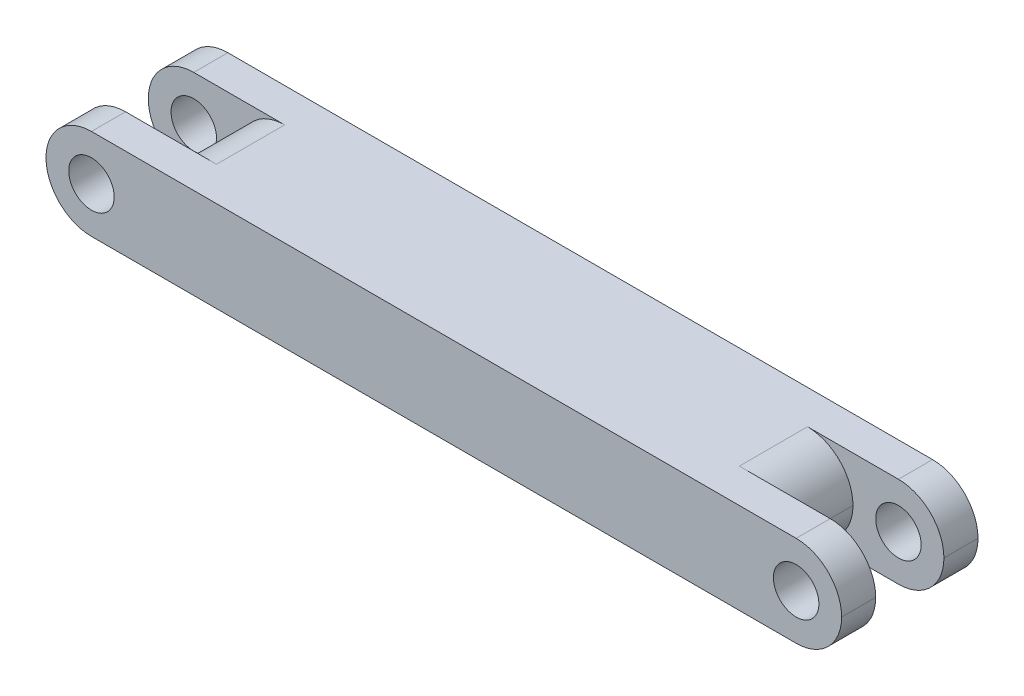
ISO-10303-21;
HEADER;
FILE_DESCRIPTION(('STEP AP214'),'2;1');
FILE_NAME('part.step','',(''),(''),'','','');
FILE_SCHEMA(('AUTOMOTIVE_DESIGN { 1 0 10303 214 1 1 1 1 }'));
ENDSEC;
DATA;
#1=APPLICATION_CONTEXT('core data for automotive mechanical design processes');
#2=APPLICATION_PROTOCOL_DEFINITION('international standard','automotive_design',2000,#1);
#3=PRODUCT_CONTEXT('',#1,'mechanical');
#4=PRODUCT('Part','Part','',(#3));
#5=PRODUCT_RELATED_PRODUCT_CATEGORY('part','',(#4));
#6=PRODUCT_DEFINITION_FORMATION('','',#4);
#7=PRODUCT_DEFINITION_CONTEXT('part definition',#1,'design');
#8=PRODUCT_DEFINITION('design','',#6,#7);
#9=PRODUCT_DEFINITION_SHAPE('','',#8);
#10=(LENGTH_UNIT() NAMED_UNIT(*) SI_UNIT(.MILLI.,.METRE.));
#11=(NAMED_UNIT(*) PLANE_ANGLE_UNIT() SI_UNIT($,.RADIAN.));
#12=(NAMED_UNIT(*) SI_UNIT($,.STERADIAN.) SOLID_ANGLE_UNIT());
#13=UNCERTAINTY_MEASURE_WITH_UNIT(LENGTH_MEASURE(1.E-05),#10,'distance_accuracy_value','');
#14=(GEOMETRIC_REPRESENTATION_CONTEXT(3) GLOBAL_UNCERTAINTY_ASSIGNED_CONTEXT((#13)) GLOBAL_UNIT_ASSIGNED_CONTEXT((#10,
#11,#12)) REPRESENTATION_CONTEXT('',''));
#15=CARTESIAN_POINT('',(0.,0.,0.));
#16=DIRECTION('',(0.,0.,1.));
#17=DIRECTION('',(1.,0.,0.));
#18=AXIS2_PLACEMENT_3D('',#15,#16,#17);
#19=CARTESIAN_POINT('',(-135.,-40.,-15.));
#20=DIRECTION('',(0.,0.,1.));
#21=DIRECTION('',(1.,0.,0.));
#22=AXIS2_PLACEMENT_3D('',#19,#20,#21);
#23=PLANE('',#22);
#24=CARTESIAN_POINT('',(-155.,-20.,-15.));
#25=DIRECTION('',(0.,0.,1.));
#26=DIRECTION('',(1.,0.,0.));
#27=AXIS2_PLACEMENT_3D('',#24,#25,#26);
#28=CIRCLE('',#27,10.);
#29=CARTESIAN_POINT('',(-145.,-20.,-15.));
#30=VERTEX_POINT('',#29);
#31=EDGE_CURVE('E304',#30,#30,#28,.T.);
#32=ORIENTED_EDGE('',*,*,#31,.F.);
#33=EDGE_LOOP('',(#32));
#34=FACE_BOUND('',#33,.T.);
#35=CARTESIAN_POINT('',(-155.,-20.,-15.));
#36=DIRECTION('',(0.,0.,1.));
#37=DIRECTION('',(1.,0.,0.));
#38=AXIS2_PLACEMENT_3D('',#35,#36,#37);
#39=CIRCLE('',#38,20.);
#40=CARTESIAN_POINT('',(-155.,0.,-15.));
#41=VERTEX_POINT('',#40);
#42=CARTESIAN_POINT('',(-175.,-20.,-15.));
#43=VERTEX_POINT('',#42);
#44=EDGE_CURVE('E162',#41,#43,#39,.T.);
#45=ORIENTED_EDGE('',*,*,#44,.T.);
#46=CARTESIAN_POINT('',(-155.,-20.,-15.));
#47=DIRECTION('',(0.,0.,1.));
#48=DIRECTION('',(1.,0.,0.));
#49=AXIS2_PLACEMENT_3D('',#46,#47,#48);
#50=CIRCLE('',#49,20.);
#51=CARTESIAN_POINT('',(-155.,-40.,-15.));
#52=VERTEX_POINT('',#51);
#53=EDGE_CURVE('E157',#43,#52,#50,.T.);
#54=ORIENTED_EDGE('',*,*,#53,.T.);
#55=DIRECTION('',(1.,0.,0.));
#56=VECTOR('',#55,1.);
#57=CARTESIAN_POINT('',(-135.,-40.,-15.));
#58=LINE('',#57,#56);
#59=CARTESIAN_POINT('',(-115.,-40.,-15.));
#60=VERTEX_POINT('',#59);
#61=EDGE_CURVE('E159',#52,#60,#58,.T.);
#62=ORIENTED_EDGE('',*,*,#61,.T.);
#63=CARTESIAN_POINT('',(-115.,-20.,-15.));
#64=DIRECTION('',(0.,0.,1.));
#65=DIRECTION('',(1.,0.,0.));
#66=AXIS2_PLACEMENT_3D('',#63,#64,#65);
#67=CIRCLE('',#66,20.);
#68=CARTESIAN_POINT('',(-135.,-20.,-15.));
#69=VERTEX_POINT('',#68);
#70=EDGE_CURVE('E48',#60,#69,#67,.F.);
#71=ORIENTED_EDGE('',*,*,#70,.T.);
#72=CARTESIAN_POINT('',(-115.,-20.,-15.));
#73=DIRECTION('',(0.,0.,1.));
#74=DIRECTION('',(1.,0.,0.));
#75=AXIS2_PLACEMENT_3D('',#72,#73,#74);
#76=CIRCLE('',#75,20.);
#77=CARTESIAN_POINT('',(-115.,0.,-15.));
#78=VERTEX_POINT('',#77);
#79=EDGE_CURVE('E11',#69,#78,#76,.F.);
#80=ORIENTED_EDGE('',*,*,#79,.T.);
#81=DIRECTION('',(1.,0.,0.));
#82=VECTOR('',#81,1.);
#83=CARTESIAN_POINT('',(-135.,0.,-15.));
#84=LINE('',#83,#82);
#85=EDGE_CURVE('E293',#41,#78,#84,.T.);
#86=ORIENTED_EDGE('',*,*,#85,.F.);
#87=EDGE_LOOP('',(#45,#54,#62,#71,#80,#86));
#88=FACE_BOUND('',#87,.T.);
#89=ADVANCED_FACE('F32',(#34,#88),#23,.T.);
#90=CARTESIAN_POINT('',(-175.,-40.,-30.));
#91=DIRECTION('',(0.,0.,-1.));
#92=DIRECTION('',(-1.,0.,0.));
#93=AXIS2_PLACEMENT_3D('',#90,#91,#92);
#94=PLANE('',#93);
#95=CARTESIAN_POINT('',(155.,-20.,-30.));
#96=DIRECTION('',(0.,0.,-1.));
#97=DIRECTION('',(-1.,0.,0.));
#98=AXIS2_PLACEMENT_3D('',#95,#96,#97);
#99=CIRCLE('',#98,10.);
#100=CARTESIAN_POINT('',(145.,-20.,-30.));
#101=VERTEX_POINT('',#100);
#102=EDGE_CURVE('E438',#101,#101,#99,.F.);
#103=ORIENTED_EDGE('',*,*,#102,.T.);
#104=EDGE_LOOP('',(#103));
#105=FACE_BOUND('',#104,.T.);
#106=CARTESIAN_POINT('',(-155.,-20.,-30.));
#107=DIRECTION('',(0.,0.,-1.));
#108=DIRECTION('',(-1.,0.,0.));
#109=AXIS2_PLACEMENT_3D('',#106,#107,#108);
#110=CIRCLE('',#109,10.);
#111=CARTESIAN_POINT('',(-165.,-20.,-30.));
#112=VERTEX_POINT('',#111);
#113=EDGE_CURVE('E305',#112,#112,#110,.F.);
#114=ORIENTED_EDGE('',*,*,#113,.T.);
#115=EDGE_LOOP('',(#114));
#116=FACE_BOUND('',#115,.T.);
#117=DIRECTION('',(-1.,0.,0.));
#118=VECTOR('',#117,1.);
#119=CARTESIAN_POINT('',(-175.,-40.,-30.));
#120=LINE('',#119,#118);
#121=CARTESIAN_POINT('',(155.,-40.,-30.));
#122=VERTEX_POINT('',#121);
#123=CARTESIAN_POINT('',(-155.,-40.,-30.));
#124=VERTEX_POINT('',#123);
#125=EDGE_CURVE('E307',#122,#124,#120,.T.);
#126=ORIENTED_EDGE('',*,*,#125,.T.);
#127=CARTESIAN_POINT('',(-155.,-20.,-30.));
#128=DIRECTION('',(0.,0.,-1.));
#129=DIRECTION('',(-1.,0.,0.));
#130=AXIS2_PLACEMENT_3D('',#127,#128,#129);
#131=CIRCLE('',#130,20.);
#132=CARTESIAN_POINT('',(-175.,-20.,-30.));
#133=VERTEX_POINT('',#132);
#134=EDGE_CURVE('E182',#124,#133,#131,.T.);
#135=ORIENTED_EDGE('',*,*,#134,.T.);
#136=CARTESIAN_POINT('',(-155.,-20.,-30.));
#137=DIRECTION('',(0.,0.,-1.));
#138=DIRECTION('',(-1.,0.,0.));
#139=AXIS2_PLACEMENT_3D('',#136,#137,#138);
#140=CIRCLE('',#139,20.);
#141=CARTESIAN_POINT('',(-155.,0.,-30.));
#142=VERTEX_POINT('',#141);
#143=EDGE_CURVE('E213',#133,#142,#140,.T.);
#144=ORIENTED_EDGE('',*,*,#143,.T.);
#145=DIRECTION('',(-1.,0.,0.));
#146=VECTOR('',#145,1.);
#147=CARTESIAN_POINT('',(-175.,0.,-30.));
#148=LINE('',#147,#146);
#149=CARTESIAN_POINT('',(155.,0.,-30.));
#150=VERTEX_POINT('',#149);
#151=EDGE_CURVE('E179',#150,#142,#148,.T.);
#152=ORIENTED_EDGE('',*,*,#151,.F.);
#153=CARTESIAN_POINT('',(155.,-20.,-30.));
#154=DIRECTION('',(0.,0.,-1.));
#155=DIRECTION('',(-1.,0.,0.));
#156=AXIS2_PLACEMENT_3D('',#153,#154,#155);
#157=CIRCLE('',#156,20.);
#158=CARTESIAN_POINT('',(175.,-20.,-30.));
#159=VERTEX_POINT('',#158);
#160=EDGE_CURVE('E211',#150,#159,#157,.T.);
#161=ORIENTED_EDGE('',*,*,#160,.T.);
#162=CARTESIAN_POINT('',(155.,-20.,-30.));
#163=DIRECTION('',(0.,0.,-1.));
#164=DIRECTION('',(-1.,0.,0.));
#165=AXIS2_PLACEMENT_3D('',#162,#163,#164);
#166=CIRCLE('',#165,20.);
#167=EDGE_CURVE('E167',#159,#122,#166,.T.);
#168=ORIENTED_EDGE('',*,*,#167,.T.);
#169=EDGE_LOOP('',(#126,#135,#144,#152,#161,#168));
#170=FACE_BOUND('',#169,.T.);
#171=ADVANCED_FACE('F376',(#105,#116,#170),#94,.T.);
#172=CARTESIAN_POINT('',(175.,-40.,-15.));
#173=DIRECTION('',(0.,0.,1.));
#174=DIRECTION('',(1.,0.,0.));
#175=AXIS2_PLACEMENT_3D('',#172,#173,#174);
#176=PLANE('',#175);
#177=CARTESIAN_POINT('',(155.,-20.,-15.));
#178=DIRECTION('',(0.,0.,1.));
#179=DIRECTION('',(1.,0.,0.));
#180=AXIS2_PLACEMENT_3D('',#177,#178,#179);
#181=CIRCLE('',#180,10.);
#182=CARTESIAN_POINT('',(165.,-20.,-15.));
#183=VERTEX_POINT('',#182);
#184=EDGE_CURVE('E431',#183,#183,#181,.T.);
#185=ORIENTED_EDGE('',*,*,#184,.F.);
#186=EDGE_LOOP('',(#185));
#187=FACE_BOUND('',#186,.T.);
#188=CARTESIAN_POINT('',(155.,-20.,-15.));
#189=DIRECTION('',(0.,0.,1.));
#190=DIRECTION('',(1.,0.,0.));
#191=AXIS2_PLACEMENT_3D('',#188,#189,#190);
#192=CIRCLE('',#191,20.);
#193=CARTESIAN_POINT('',(155.,-40.,-15.));
#194=VERTEX_POINT('',#193);
#195=CARTESIAN_POINT('',(175.,-20.,-15.));
#196=VERTEX_POINT('',#195);
#197=EDGE_CURVE('E228',#194,#196,#192,.T.);
#198=ORIENTED_EDGE('',*,*,#197,.T.);
#199=CARTESIAN_POINT('',(155.,-20.,-15.));
#200=DIRECTION('',(0.,0.,1.));
#201=DIRECTION('',(1.,0.,0.));
#202=AXIS2_PLACEMENT_3D('',#199,#200,#201);
#203=CIRCLE('',#202,20.);
#204=CARTESIAN_POINT('',(155.,0.,-15.));
#205=VERTEX_POINT('',#204);
#206=EDGE_CURVE('E230',#196,#205,#203,.T.);
#207=ORIENTED_EDGE('',*,*,#206,.T.);
#208=DIRECTION('',(1.,0.,0.));
#209=VECTOR('',#208,1.);
#210=CARTESIAN_POINT('',(175.,0.,-15.));
#211=LINE('',#210,#209);
#212=CARTESIAN_POINT('',(115.,0.,-15.));
#213=VERTEX_POINT('',#212);
#214=EDGE_CURVE('E291',#213,#205,#211,.T.);
#215=ORIENTED_EDGE('',*,*,#214,.F.);
#216=CARTESIAN_POINT('',(115.,-20.,-15.));
#217=DIRECTION('',(0.,0.,1.));
#218=DIRECTION('',(1.,0.,0.));
#219=AXIS2_PLACEMENT_3D('',#216,#217,#218);
#220=CIRCLE('',#219,20.);
#221=CARTESIAN_POINT('',(135.,-20.,-15.));
#222=VERTEX_POINT('',#221);
#223=EDGE_CURVE('E241',#213,#222,#220,.F.);
#224=ORIENTED_EDGE('',*,*,#223,.T.);
#225=CARTESIAN_POINT('',(115.,-20.,-15.));
#226=DIRECTION('',(0.,0.,1.));
#227=DIRECTION('',(1.,0.,0.));
#228=AXIS2_PLACEMENT_3D('',#225,#226,#227);
#229=CIRCLE('',#228,20.);
#230=CARTESIAN_POINT('',(115.,-40.,-15.));
#231=VERTEX_POINT('',#230);
#232=EDGE_CURVE('E236',#222,#231,#229,.F.);
#233=ORIENTED_EDGE('',*,*,#232,.T.);
#234=DIRECTION('',(1.,0.,0.));
#235=VECTOR('',#234,1.);
#236=CARTESIAN_POINT('',(175.,-40.,-15.));
#237=LINE('',#236,#235);
#238=EDGE_CURVE('E310',#231,#194,#237,.T.);
#239=ORIENTED_EDGE('',*,*,#238,.T.);
#240=EDGE_LOOP('',(#198,#207,#215,#224,#233,#239));
#241=FACE_BOUND('',#240,.T.);
#242=ADVANCED_FACE('F315',(#187,#241),#176,.T.);
#243=CARTESIAN_POINT('',(175.,-40.,15.));
#244=DIRECTION('',(0.,0.,-1.));
#245=DIRECTION('',(-1.,0.,0.));
#246=AXIS2_PLACEMENT_3D('',#243,#244,#245);
#247=PLANE('',#246);
#248=CARTESIAN_POINT('',(155.,-20.,15.));
#249=DIRECTION('',(0.,0.,-1.));
#250=DIRECTION('',(-1.,0.,0.));
#251=AXIS2_PLACEMENT_3D('',#248,#249,#250);
#252=CIRCLE('',#251,10.);
#253=CARTESIAN_POINT('',(145.,-20.,15.));
#254=VERTEX_POINT('',#253);
#255=EDGE_CURVE('E433',#254,#254,#252,.T.);
#256=ORIENTED_EDGE('',*,*,#255,.F.);
#257=EDGE_LOOP('',(#256));
#258=FACE_BOUND('',#257,.T.);
#259=CARTESIAN_POINT('',(155.,-20.,15.));
#260=DIRECTION('',(0.,0.,-1.));
#261=DIRECTION('',(-1.,0.,0.));
#262=AXIS2_PLACEMENT_3D('',#259,#260,#261);
#263=CIRCLE('',#262,20.);
#264=CARTESIAN_POINT('',(155.,0.,15.));
#265=VERTEX_POINT('',#264);
#266=CARTESIAN_POINT('',(175.,-20.,15.));
#267=VERTEX_POINT('',#266);
#268=EDGE_CURVE('E232',#265,#267,#263,.T.);
#269=ORIENTED_EDGE('',*,*,#268,.T.);
#270=CARTESIAN_POINT('',(155.,-20.,15.));
#271=DIRECTION('',(0.,0.,-1.));
#272=DIRECTION('',(-1.,0.,0.));
#273=AXIS2_PLACEMENT_3D('',#270,#271,#272);
#274=CIRCLE('',#273,20.);
#275=CARTESIAN_POINT('',(155.,-40.,15.));
#276=VERTEX_POINT('',#275);
#277=EDGE_CURVE('E234',#267,#276,#274,.T.);
#278=ORIENTED_EDGE('',*,*,#277,.T.);
#279=DIRECTION('',(-1.,0.,0.));
#280=VECTOR('',#279,1.);
#281=CARTESIAN_POINT('',(175.,-40.,15.));
#282=LINE('',#281,#280);
#283=CARTESIAN_POINT('',(115.,-40.,15.));
#284=VERTEX_POINT('',#283);
#285=EDGE_CURVE('E318',#276,#284,#282,.T.);
#286=ORIENTED_EDGE('',*,*,#285,.T.);
#287=CARTESIAN_POINT('',(115.,-20.,15.));
#288=DIRECTION('',(0.,0.,-1.));
#289=DIRECTION('',(-1.,0.,0.));
#290=AXIS2_PLACEMENT_3D('',#287,#288,#289);
#291=CIRCLE('',#290,20.);
#292=CARTESIAN_POINT('',(135.,-20.,15.));
#293=VERTEX_POINT('',#292);
#294=EDGE_CURVE('E239',#284,#293,#291,.F.);
#295=ORIENTED_EDGE('',*,*,#294,.T.);
#296=CARTESIAN_POINT('',(115.,-20.,15.));
#297=DIRECTION('',(0.,0.,-1.));
#298=DIRECTION('',(-1.,0.,0.));
#299=AXIS2_PLACEMENT_3D('',#296,#297,#298);
#300=CIRCLE('',#299,20.);
#301=CARTESIAN_POINT('',(115.,0.,15.));
#302=VERTEX_POINT('',#301);
#303=EDGE_CURVE('E243',#293,#302,#300,.F.);
#304=ORIENTED_EDGE('',*,*,#303,.T.);
#305=DIRECTION('',(-1.,0.,0.));
#306=VECTOR('',#305,1.);
#307=CARTESIAN_POINT('',(175.,0.,15.));
#308=LINE('',#307,#306);
#309=EDGE_CURVE('E288',#265,#302,#308,.T.);
#310=ORIENTED_EDGE('',*,*,#309,.F.);
#311=EDGE_LOOP('',(#269,#278,#286,#295,#304,#310));
#312=FACE_BOUND('',#311,.T.);
#313=ADVANCED_FACE('F414',(#258,#312),#247,.T.);
#314=CARTESIAN_POINT('',(-175.,-40.,30.));
#315=DIRECTION('',(0.,0.,1.));
#316=DIRECTION('',(1.,0.,0.));
#317=AXIS2_PLACEMENT_3D('',#314,#315,#316);
#318=PLANE('',#317);
#319=CARTESIAN_POINT('',(155.,-20.,30.));
#320=DIRECTION('',(0.,0.,1.));
#321=DIRECTION('',(-1.,0.,0.));
#322=AXIS2_PLACEMENT_3D('',#319,#320,#321);
#323=CIRCLE('',#322,10.);
#324=CARTESIAN_POINT('',(145.,-20.,30.));
#325=VERTEX_POINT('',#324);
#326=EDGE_CURVE('E253',#325,#325,#323,.T.);
#327=ORIENTED_EDGE('',*,*,#326,.F.);
#328=EDGE_LOOP('',(#327));
#329=FACE_BOUND('',#328,.T.);
#330=CARTESIAN_POINT('',(-155.,-20.,30.));
#331=DIRECTION('',(0.,0.,1.));
#332=DIRECTION('',(1.,0.,0.));
#333=AXIS2_PLACEMENT_3D('',#330,#331,#332);
#334=CIRCLE('',#333,10.);
#335=CARTESIAN_POINT('',(-145.,-20.,30.));
#336=VERTEX_POINT('',#335);
#337=EDGE_CURVE('E429',#336,#336,#334,.T.);
#338=ORIENTED_EDGE('',*,*,#337,.F.);
#339=EDGE_LOOP('',(#338));
#340=FACE_BOUND('',#339,.T.);
#341=DIRECTION('',(1.,0.,0.));
#342=VECTOR('',#341,1.);
#343=CARTESIAN_POINT('',(-175.,0.,30.));
#344=LINE('',#343,#342);
#345=CARTESIAN_POINT('',(-155.,0.,30.));
#346=VERTEX_POINT('',#345);
#347=CARTESIAN_POINT('',(155.,0.,30.));
#348=VERTEX_POINT('',#347);
#349=EDGE_CURVE('E281',#346,#348,#344,.T.);
#350=ORIENTED_EDGE('',*,*,#349,.F.);
#351=CARTESIAN_POINT('',(-155.,-20.,30.));
#352=DIRECTION('',(0.,0.,1.));
#353=DIRECTION('',(1.,0.,0.));
#354=AXIS2_PLACEMENT_3D('',#351,#352,#353);
#355=CIRCLE('',#354,20.);
#356=CARTESIAN_POINT('',(-175.,-20.,30.));
#357=VERTEX_POINT('',#356);
#358=EDGE_CURVE('E222',#346,#357,#355,.T.);
#359=ORIENTED_EDGE('',*,*,#358,.T.);
#360=CARTESIAN_POINT('',(-155.,-20.,30.));
#361=DIRECTION('',(0.,0.,1.));
#362=DIRECTION('',(1.,0.,0.));
#363=AXIS2_PLACEMENT_3D('',#360,#361,#362);
#364=CIRCLE('',#363,20.);
#365=CARTESIAN_POINT('',(-155.,-40.,30.));
#366=VERTEX_POINT('',#365);
#367=EDGE_CURVE('E220',#357,#366,#364,.T.);
#368=ORIENTED_EDGE('',*,*,#367,.T.);
#369=DIRECTION('',(1.,0.,0.));
#370=VECTOR('',#369,1.);
#371=CARTESIAN_POINT('',(-175.,-40.,30.));
#372=LINE('',#371,#370);
#373=CARTESIAN_POINT('',(155.,-40.,30.));
#374=VERTEX_POINT('',#373);
#375=EDGE_CURVE('E336',#366,#374,#372,.T.);
#376=ORIENTED_EDGE('',*,*,#375,.T.);
#377=CARTESIAN_POINT('',(155.,-20.,30.));
#378=DIRECTION('',(0.,0.,1.));
#379=DIRECTION('',(1.,0.,0.));
#380=AXIS2_PLACEMENT_3D('',#377,#378,#379);
#381=CIRCLE('',#380,20.);
#382=CARTESIAN_POINT('',(175.,-20.,30.));
#383=VERTEX_POINT('',#382);
#384=EDGE_CURVE('E218',#374,#383,#381,.T.);
#385=ORIENTED_EDGE('',*,*,#384,.T.);
#386=CARTESIAN_POINT('',(155.,-20.,30.));
#387=DIRECTION('',(0.,0.,1.));
#388=DIRECTION('',(1.,0.,0.));
#389=AXIS2_PLACEMENT_3D('',#386,#387,#388);
#390=CIRCLE('',#389,20.);
#391=EDGE_CURVE('E216',#383,#348,#390,.T.);
#392=ORIENTED_EDGE('',*,*,#391,.T.);
#393=EDGE_LOOP('',(#350,#359,#368,#376,#385,#392));
#394=FACE_BOUND('',#393,.T.);
#395=ADVANCED_FACE('F280',(#329,#340,#394),#318,.T.);
#396=CARTESIAN_POINT('',(-135.,-40.,15.));
#397=DIRECTION('',(0.,0.,-1.));
#398=DIRECTION('',(-1.,0.,0.));
#399=AXIS2_PLACEMENT_3D('',#396,#397,#398);
#400=PLANE('',#399);
#401=CARTESIAN_POINT('',(-155.,-20.,15.));
#402=DIRECTION('',(0.,0.,-1.));
#403=DIRECTION('',(-1.,0.,0.));
#404=AXIS2_PLACEMENT_3D('',#401,#402,#403);
#405=CIRCLE('',#404,10.);
#406=CARTESIAN_POINT('',(-165.,-20.,15.));
#407=VERTEX_POINT('',#406);
#408=EDGE_CURVE('E301',#407,#407,#405,.T.);
#409=ORIENTED_EDGE('',*,*,#408,.F.);
#410=EDGE_LOOP('',(#409));
#411=FACE_BOUND('',#410,.T.);
#412=CARTESIAN_POINT('',(-155.,-20.,15.));
#413=DIRECTION('',(0.,0.,-1.));
#414=DIRECTION('',(-1.,0.,0.));
#415=AXIS2_PLACEMENT_3D('',#412,#413,#414);
#416=CIRCLE('',#415,20.);
#417=CARTESIAN_POINT('',(-155.,-40.,15.));
#418=VERTEX_POINT('',#417);
#419=CARTESIAN_POINT('',(-175.,-20.,15.));
#420=VERTEX_POINT('',#419);
#421=EDGE_CURVE('E224',#418,#420,#416,.T.);
#422=ORIENTED_EDGE('',*,*,#421,.T.);
#423=CARTESIAN_POINT('',(-155.,-20.,15.));
#424=DIRECTION('',(0.,0.,-1.));
#425=DIRECTION('',(-1.,0.,0.));
#426=AXIS2_PLACEMENT_3D('',#423,#424,#425);
#427=CIRCLE('',#426,20.);
#428=CARTESIAN_POINT('',(-155.,0.,15.));
#429=VERTEX_POINT('',#428);
#430=EDGE_CURVE('E226',#420,#429,#427,.T.);
#431=ORIENTED_EDGE('',*,*,#430,.T.);
#432=DIRECTION('',(-1.,0.,0.));
#433=VECTOR('',#432,1.);
#434=CARTESIAN_POINT('',(-135.,0.,15.));
#435=LINE('',#434,#433);
#436=CARTESIAN_POINT('',(-115.,0.,15.));
#437=VERTEX_POINT('',#436);
#438=EDGE_CURVE('E289',#437,#429,#435,.T.);
#439=ORIENTED_EDGE('',*,*,#438,.F.);
#440=CARTESIAN_POINT('',(-115.,-20.,15.));
#441=DIRECTION('',(0.,0.,-1.));
#442=DIRECTION('',(-1.,0.,0.));
#443=AXIS2_PLACEMENT_3D('',#440,#441,#442);
#444=CIRCLE('',#443,20.);
#445=CARTESIAN_POINT('',(-135.,-20.,15.));
#446=VERTEX_POINT('',#445);
#447=EDGE_CURVE('E41',#437,#446,#444,.F.);
#448=ORIENTED_EDGE('',*,*,#447,.T.);
#449=CARTESIAN_POINT('',(-115.,-20.,15.));
#450=DIRECTION('',(0.,0.,-1.));
#451=DIRECTION('',(-1.,0.,0.));
#452=AXIS2_PLACEMENT_3D('',#449,#450,#451);
#453=CIRCLE('',#452,20.);
#454=CARTESIAN_POINT('',(-115.,-40.,15.));
#455=VERTEX_POINT('',#454);
#456=EDGE_CURVE('E246',#446,#455,#453,.F.);
#457=ORIENTED_EDGE('',*,*,#456,.T.);
#458=DIRECTION('',(-1.,0.,0.));
#459=VECTOR('',#458,1.);
#460=CARTESIAN_POINT('',(-135.,-40.,15.));
#461=LINE('',#460,#459);
#462=EDGE_CURVE('E178',#455,#418,#461,.T.);
#463=ORIENTED_EDGE('',*,*,#462,.T.);
#464=EDGE_LOOP('',(#422,#431,#439,#448,#457,#463));
#465=FACE_BOUND('',#464,.T.);
#466=ADVANCED_FACE('F349',(#411,#465),#400,.T.);
#467=CARTESIAN_POINT('',(0.,-40.,0.));
#468=DIRECTION('',(0.,-1.,0.));
#469=DIRECTION('',(0.,0.,-1.));
#470=AXIS2_PLACEMENT_3D('',#467,#468,#469);
#471=PLANE('',#470);
#472=ORIENTED_EDGE('',*,*,#238,.F.);
#473=DIRECTION('',(0.,0.,-1.));
#474=VECTOR('',#473,1.);
#475=CARTESIAN_POINT('',(115.,-40.,0.));
#476=LINE('',#475,#474);
#477=EDGE_CURVE('E185',#231,#284,#476,.F.);
#478=ORIENTED_EDGE('',*,*,#477,.T.);
#479=ORIENTED_EDGE('',*,*,#285,.F.);
#480=DIRECTION('',(0.,0.,-1.));
#481=VECTOR('',#480,1.);
#482=CARTESIAN_POINT('',(155.,-40.,0.));
#483=LINE('',#482,#481);
#484=EDGE_CURVE('E306',#276,#374,#483,.F.);
#485=ORIENTED_EDGE('',*,*,#484,.T.);
#486=ORIENTED_EDGE('',*,*,#375,.F.);
#487=DIRECTION('',(0.,0.,1.));
#488=VECTOR('',#487,1.);
#489=CARTESIAN_POINT('',(-155.,-40.,0.));
#490=LINE('',#489,#488);
#491=EDGE_CURVE('E183',#366,#418,#490,.F.);
#492=ORIENTED_EDGE('',*,*,#491,.T.);
#493=ORIENTED_EDGE('',*,*,#462,.F.);
#494=DIRECTION('',(0.,0.,1.));
#495=VECTOR('',#494,1.);
#496=CARTESIAN_POINT('',(-115.,-40.,-2.12792746386488E-13));
#497=LINE('',#496,#495);
#498=EDGE_CURVE('E177',#455,#60,#497,.F.);
#499=ORIENTED_EDGE('',*,*,#498,.T.);
#500=ORIENTED_EDGE('',*,*,#61,.F.);
#501=DIRECTION('',(0.,0.,1.));
#502=VECTOR('',#501,1.);
#503=CARTESIAN_POINT('',(-155.,-40.,0.));
#504=LINE('',#503,#502);
#505=EDGE_CURVE('E174',#52,#124,#504,.F.);
#506=ORIENTED_EDGE('',*,*,#505,.T.);
#507=ORIENTED_EDGE('',*,*,#125,.F.);
#508=DIRECTION('',(0.,0.,-1.));
#509=VECTOR('',#508,1.);
#510=CARTESIAN_POINT('',(155.,-40.,0.));
#511=LINE('',#510,#509);
#512=EDGE_CURVE('E187',#122,#194,#511,.F.);
#513=ORIENTED_EDGE('',*,*,#512,.T.);
#514=EDGE_LOOP('',(#472,#478,#479,#485,#486,#492,#493,#499,#500,#506,#507,#513));
#515=FACE_BOUND('',#514,.T.);
#516=ADVANCED_FACE('F172',(#515),#471,.T.);
#517=CARTESIAN_POINT('',(0.,0.,0.));
#518=DIRECTION('',(0.,-1.,0.));
#519=DIRECTION('',(0.,0.,-1.));
#520=AXIS2_PLACEMENT_3D('',#517,#518,#519);
#521=PLANE('',#520);
#522=DIRECTION('',(0.,0.,-1.));
#523=VECTOR('',#522,1.);
#524=CARTESIAN_POINT('',(115.,0.,-15.));
#525=LINE('',#524,#523);
#526=EDGE_CURVE('E206',#302,#213,#525,.T.);
#527=ORIENTED_EDGE('',*,*,#526,.T.);
#528=ORIENTED_EDGE('',*,*,#214,.T.);
#529=DIRECTION('',(0.,0.,-1.));
#530=VECTOR('',#529,1.);
#531=CARTESIAN_POINT('',(155.,0.,-30.));
#532=LINE('',#531,#530);
#533=EDGE_CURVE('E195',#205,#150,#532,.T.);
#534=ORIENTED_EDGE('',*,*,#533,.T.);
#535=ORIENTED_EDGE('',*,*,#151,.T.);
#536=DIRECTION('',(0.,0.,1.));
#537=VECTOR('',#536,1.);
#538=CARTESIAN_POINT('',(-155.,0.,-15.));
#539=LINE('',#538,#537);
#540=EDGE_CURVE('E201',#142,#41,#539,.T.);
#541=ORIENTED_EDGE('',*,*,#540,.T.);
#542=ORIENTED_EDGE('',*,*,#85,.T.);
#543=DIRECTION('',(0.,0.,1.));
#544=VECTOR('',#543,1.);
#545=CARTESIAN_POINT('',(-115.,0.,15.));
#546=LINE('',#545,#544);
#547=EDGE_CURVE('E203',#78,#437,#546,.T.);
#548=ORIENTED_EDGE('',*,*,#547,.T.);
#549=ORIENTED_EDGE('',*,*,#438,.T.);
#550=DIRECTION('',(0.,0.,1.));
#551=VECTOR('',#550,1.);
#552=CARTESIAN_POINT('',(-155.,0.,30.));
#553=LINE('',#552,#551);
#554=EDGE_CURVE('E198',#429,#346,#553,.T.);
#555=ORIENTED_EDGE('',*,*,#554,.T.);
#556=ORIENTED_EDGE('',*,*,#349,.T.);
#557=DIRECTION('',(0.,0.,-1.));
#558=VECTOR('',#557,1.);
#559=CARTESIAN_POINT('',(155.,0.,15.));
#560=LINE('',#559,#558);
#561=EDGE_CURVE('E193',#348,#265,#560,.T.);
#562=ORIENTED_EDGE('',*,*,#561,.T.);
#563=ORIENTED_EDGE('',*,*,#309,.T.);
#564=EDGE_LOOP('',(#527,#528,#534,#535,#541,#542,#548,#549,#555,#556,#562,#563));
#565=FACE_BOUND('',#564,.T.);
#566=ADVANCED_FACE('F284',(#565),#521,.F.);
#567=CARTESIAN_POINT('',(-155.,-20.,-58.2842712474619));
#568=DIRECTION('',(0.,0.,1.));
#569=DIRECTION('',(1.,0.,0.));
#570=AXIS2_PLACEMENT_3D('',#567,#568,#569);
#571=CYLINDRICAL_SURFACE('',#570,10.);
#572=ORIENTED_EDGE('',*,*,#408,.T.);
#573=EDGE_LOOP('',(#572));
#574=FACE_BOUND('',#573,.T.);
#575=ORIENTED_EDGE('',*,*,#337,.T.);
#576=EDGE_LOOP('',(#575));
#577=FACE_BOUND('',#576,.T.);
#578=ADVANCED_FACE('F404',(#574,#577),#571,.F.);
#579=ORIENTED_EDGE('',*,*,#31,.T.);
#580=EDGE_LOOP('',(#579));
#581=FACE_BOUND('',#580,.T.);
#582=ORIENTED_EDGE('',*,*,#113,.F.);
#583=EDGE_LOOP('',(#582));
#584=FACE_BOUND('',#583,.T.);
#585=ADVANCED_FACE('F399',(#581,#584),#571,.F.);
#586=CARTESIAN_POINT('',(155.,-20.,-58.2842712474619));
#587=DIRECTION('',(0.,0.,1.));
#588=DIRECTION('',(1.,0.,0.));
#589=AXIS2_PLACEMENT_3D('',#586,#587,#588);
#590=CYLINDRICAL_SURFACE('',#589,10.);
#591=ORIENTED_EDGE('',*,*,#255,.T.);
#592=EDGE_LOOP('',(#591));
#593=FACE_BOUND('',#592,.T.);
#594=ORIENTED_EDGE('',*,*,#326,.T.);
#595=EDGE_LOOP('',(#594));
#596=FACE_BOUND('',#595,.T.);
#597=ADVANCED_FACE('F393',(#593,#596),#590,.F.);
#598=ORIENTED_EDGE('',*,*,#184,.T.);
#599=EDGE_LOOP('',(#598));
#600=FACE_BOUND('',#599,.T.);
#601=ORIENTED_EDGE('',*,*,#102,.F.);
#602=EDGE_LOOP('',(#601));
#603=FACE_BOUND('',#602,.T.);
#604=ADVANCED_FACE('F389',(#600,#603),#590,.F.);
#605=CARTESIAN_POINT('',(115.,-20.,0.));
#606=DIRECTION('',(0.,0.,1.));
#607=DIRECTION('',(1.,0.,0.));
#608=AXIS2_PLACEMENT_3D('',#605,#606,#607);
#609=CYLINDRICAL_SURFACE('',#608,20.);
#610=ORIENTED_EDGE('',*,*,#526,.F.);
#611=ORIENTED_EDGE('',*,*,#303,.F.);
#612=DIRECTION('',(0.,0.,-1.));
#613=VECTOR('',#612,1.);
#614=CARTESIAN_POINT('',(135.,-20.,15.));
#615=LINE('',#614,#613);
#616=EDGE_CURVE('E250',#222,#293,#615,.F.);
#617=ORIENTED_EDGE('',*,*,#616,.F.);
#618=ORIENTED_EDGE('',*,*,#223,.F.);
#619=EDGE_LOOP('',(#610,#611,#617,#618));
#620=FACE_BOUND('',#619,.T.);
#621=ADVANCED_FACE('F329',(#620),#609,.T.);
#622=CARTESIAN_POINT('',(115.,-20.,-15.));
#623=DIRECTION('',(0.,0.,-1.));
#624=DIRECTION('',(-1.,0.,0.));
#625=AXIS2_PLACEMENT_3D('',#622,#623,#624);
#626=CYLINDRICAL_SURFACE('',#625,20.);
#627=ORIENTED_EDGE('',*,*,#294,.F.);
#628=ORIENTED_EDGE('',*,*,#477,.F.);
#629=ORIENTED_EDGE('',*,*,#232,.F.);
#630=ORIENTED_EDGE('',*,*,#616,.T.);
#631=EDGE_LOOP('',(#627,#628,#629,#630));
#632=FACE_BOUND('',#631,.T.);
#633=ADVANCED_FACE('F332',(#632),#626,.T.);
#634=CARTESIAN_POINT('',(-115.,-20.,-2.12792746386488E-13));
#635=DIRECTION('',(0.,0.,-1.));
#636=DIRECTION('',(-1.,0.,0.));
#637=AXIS2_PLACEMENT_3D('',#634,#635,#636);
#638=CYLINDRICAL_SURFACE('',#637,20.);
#639=ORIENTED_EDGE('',*,*,#547,.F.);
#640=ORIENTED_EDGE('',*,*,#79,.F.);
#641=DIRECTION('',(0.,0.,1.));
#642=VECTOR('',#641,1.);
#643=CARTESIAN_POINT('',(-135.,-20.,-15.));
#644=LINE('',#643,#642);
#645=EDGE_CURVE('E254',#446,#69,#644,.F.);
#646=ORIENTED_EDGE('',*,*,#645,.F.);
#647=ORIENTED_EDGE('',*,*,#447,.F.);
#648=EDGE_LOOP('',(#639,#640,#646,#647));
#649=FACE_BOUND('',#648,.T.);
#650=ADVANCED_FACE('F361',(#649),#638,.T.);
#651=CARTESIAN_POINT('',(-115.,-20.,15.));
#652=DIRECTION('',(0.,0.,1.));
#653=DIRECTION('',(1.,0.,0.));
#654=AXIS2_PLACEMENT_3D('',#651,#652,#653);
#655=CYLINDRICAL_SURFACE('',#654,20.);
#656=ORIENTED_EDGE('',*,*,#70,.F.);
#657=ORIENTED_EDGE('',*,*,#498,.F.);
#658=ORIENTED_EDGE('',*,*,#456,.F.);
#659=ORIENTED_EDGE('',*,*,#645,.T.);
#660=EDGE_LOOP('',(#656,#657,#658,#659));
#661=FACE_BOUND('',#660,.T.);
#662=ADVANCED_FACE('F363',(#661),#655,.T.);
#663=CARTESIAN_POINT('',(-155.,-20.,0.));
#664=DIRECTION('',(0.,0.,-1.));
#665=DIRECTION('',(-1.,0.,0.));
#666=AXIS2_PLACEMENT_3D('',#663,#664,#665);
#667=CYLINDRICAL_SURFACE('',#666,20.);
#668=ORIENTED_EDGE('',*,*,#540,.F.);
#669=ORIENTED_EDGE('',*,*,#143,.F.);
#670=DIRECTION('',(0.,0.,1.));
#671=VECTOR('',#670,1.);
#672=CARTESIAN_POINT('',(-175.,-20.,-30.));
#673=LINE('',#672,#671);
#674=EDGE_CURVE('E257',#43,#133,#673,.F.);
#675=ORIENTED_EDGE('',*,*,#674,.F.);
#676=ORIENTED_EDGE('',*,*,#44,.F.);
#677=EDGE_LOOP('',(#668,#669,#675,#676));
#678=FACE_BOUND('',#677,.T.);
#679=ADVANCED_FACE('F365',(#678),#667,.T.);
#680=CARTESIAN_POINT('',(-155.,-20.,-15.));
#681=DIRECTION('',(0.,0.,1.));
#682=DIRECTION('',(1.,0.,0.));
#683=AXIS2_PLACEMENT_3D('',#680,#681,#682);
#684=CYLINDRICAL_SURFACE('',#683,20.);
#685=ORIENTED_EDGE('',*,*,#134,.F.);
#686=ORIENTED_EDGE('',*,*,#505,.F.);
#687=ORIENTED_EDGE('',*,*,#53,.F.);
#688=ORIENTED_EDGE('',*,*,#674,.T.);
#689=EDGE_LOOP('',(#685,#686,#687,#688));
#690=FACE_BOUND('',#689,.T.);
#691=ADVANCED_FACE('F181',(#690),#684,.T.);
#692=CARTESIAN_POINT('',(-155.,-20.,15.));
#693=DIRECTION('',(0.,0.,1.));
#694=DIRECTION('',(1.,0.,0.));
#695=AXIS2_PLACEMENT_3D('',#692,#693,#694);
#696=CYLINDRICAL_SURFACE('',#695,20.);
#697=DIRECTION('',(0.,0.,1.));
#698=VECTOR('',#697,1.);
#699=CARTESIAN_POINT('',(-175.,-20.,15.));
#700=LINE('',#699,#698);
#701=EDGE_CURVE('E259',#420,#357,#700,.T.);
#702=ORIENTED_EDGE('',*,*,#701,.F.);
#703=ORIENTED_EDGE('',*,*,#421,.F.);
#704=ORIENTED_EDGE('',*,*,#491,.F.);
#705=ORIENTED_EDGE('',*,*,#367,.F.);
#706=EDGE_LOOP('',(#702,#703,#704,#705));
#707=FACE_BOUND('',#706,.T.);
#708=ADVANCED_FACE('F354',(#707),#696,.T.);
#709=CARTESIAN_POINT('',(-155.,-20.,0.));
#710=DIRECTION('',(0.,0.,-1.));
#711=DIRECTION('',(-1.,0.,0.));
#712=AXIS2_PLACEMENT_3D('',#709,#710,#711);
#713=CYLINDRICAL_SURFACE('',#712,20.);
#714=ORIENTED_EDGE('',*,*,#430,.F.);
#715=ORIENTED_EDGE('',*,*,#701,.T.);
#716=ORIENTED_EDGE('',*,*,#358,.F.);
#717=ORIENTED_EDGE('',*,*,#554,.F.);
#718=EDGE_LOOP('',(#714,#715,#716,#717));
#719=FACE_BOUND('',#718,.T.);
#720=ADVANCED_FACE('F358',(#719),#713,.T.);
#721=CARTESIAN_POINT('',(155.,-20.,-30.));
#722=DIRECTION('',(0.,0.,-1.));
#723=DIRECTION('',(-1.,0.,0.));
#724=AXIS2_PLACEMENT_3D('',#721,#722,#723);
#725=CYLINDRICAL_SURFACE('',#724,20.);
#726=DIRECTION('',(0.,0.,-1.));
#727=VECTOR('',#726,1.);
#728=CARTESIAN_POINT('',(175.,-20.,-30.));
#729=LINE('',#728,#727);
#730=EDGE_CURVE('E261',#196,#159,#729,.T.);
#731=ORIENTED_EDGE('',*,*,#730,.F.);
#732=ORIENTED_EDGE('',*,*,#197,.F.);
#733=ORIENTED_EDGE('',*,*,#512,.F.);
#734=ORIENTED_EDGE('',*,*,#167,.F.);
#735=EDGE_LOOP('',(#731,#732,#733,#734));
#736=FACE_BOUND('',#735,.T.);
#737=ADVANCED_FACE('F320',(#736),#725,.T.);
#738=CARTESIAN_POINT('',(155.,-20.,0.));
#739=DIRECTION('',(0.,0.,1.));
#740=DIRECTION('',(1.,0.,0.));
#741=AXIS2_PLACEMENT_3D('',#738,#739,#740);
#742=CYLINDRICAL_SURFACE('',#741,20.);
#743=ORIENTED_EDGE('',*,*,#206,.F.);
#744=ORIENTED_EDGE('',*,*,#730,.T.);
#745=ORIENTED_EDGE('',*,*,#160,.F.);
#746=ORIENTED_EDGE('',*,*,#533,.F.);
#747=EDGE_LOOP('',(#743,#744,#745,#746));
#748=FACE_BOUND('',#747,.T.);
#749=ADVANCED_FACE('F322',(#748),#742,.T.);
#750=CARTESIAN_POINT('',(155.,-20.,0.));
#751=DIRECTION('',(0.,0.,1.));
#752=DIRECTION('',(1.,0.,0.));
#753=AXIS2_PLACEMENT_3D('',#750,#751,#752);
#754=CYLINDRICAL_SURFACE('',#753,20.);
#755=ORIENTED_EDGE('',*,*,#561,.F.);
#756=ORIENTED_EDGE('',*,*,#391,.F.);
#757=DIRECTION('',(0.,0.,-1.));
#758=VECTOR('',#757,1.);
#759=CARTESIAN_POINT('',(175.,-20.,30.));
#760=LINE('',#759,#758);
#761=EDGE_CURVE('E36',#267,#383,#760,.F.);
#762=ORIENTED_EDGE('',*,*,#761,.F.);
#763=ORIENTED_EDGE('',*,*,#268,.F.);
#764=EDGE_LOOP('',(#755,#756,#762,#763));
#765=FACE_BOUND('',#764,.T.);
#766=ADVANCED_FACE('F34',(#765),#754,.T.);
#767=CARTESIAN_POINT('',(155.,-20.,30.));
#768=DIRECTION('',(0.,0.,-1.));
#769=DIRECTION('',(-1.,0.,0.));
#770=AXIS2_PLACEMENT_3D('',#767,#768,#769);
#771=CYLINDRICAL_SURFACE('',#770,20.);
#772=ORIENTED_EDGE('',*,*,#384,.F.);
#773=ORIENTED_EDGE('',*,*,#484,.F.);
#774=ORIENTED_EDGE('',*,*,#277,.F.);
#775=ORIENTED_EDGE('',*,*,#761,.T.);
#776=EDGE_LOOP('',(#772,#773,#774,#775));
#777=FACE_BOUND('',#776,.T.);
#778=ADVANCED_FACE('F270',(#777),#771,.T.);
#779=CLOSED_SHELL('',(#89,#171,#242,#313,#395,#466,#516,#566,#578,#585,#597,#604,#621,#633,#650,
#662,#679,#691,#708,#720,#737,#749,#766,#778));
#780=MANIFOLD_SOLID_BREP('B2',#779);
#781=ADVANCED_BREP_SHAPE_REPRESENTATION('',(#18,#780),#14);
#782=SHAPE_DEFINITION_REPRESENTATION(#9,#781);
ENDSEC;
END-ISO-10303-21;
